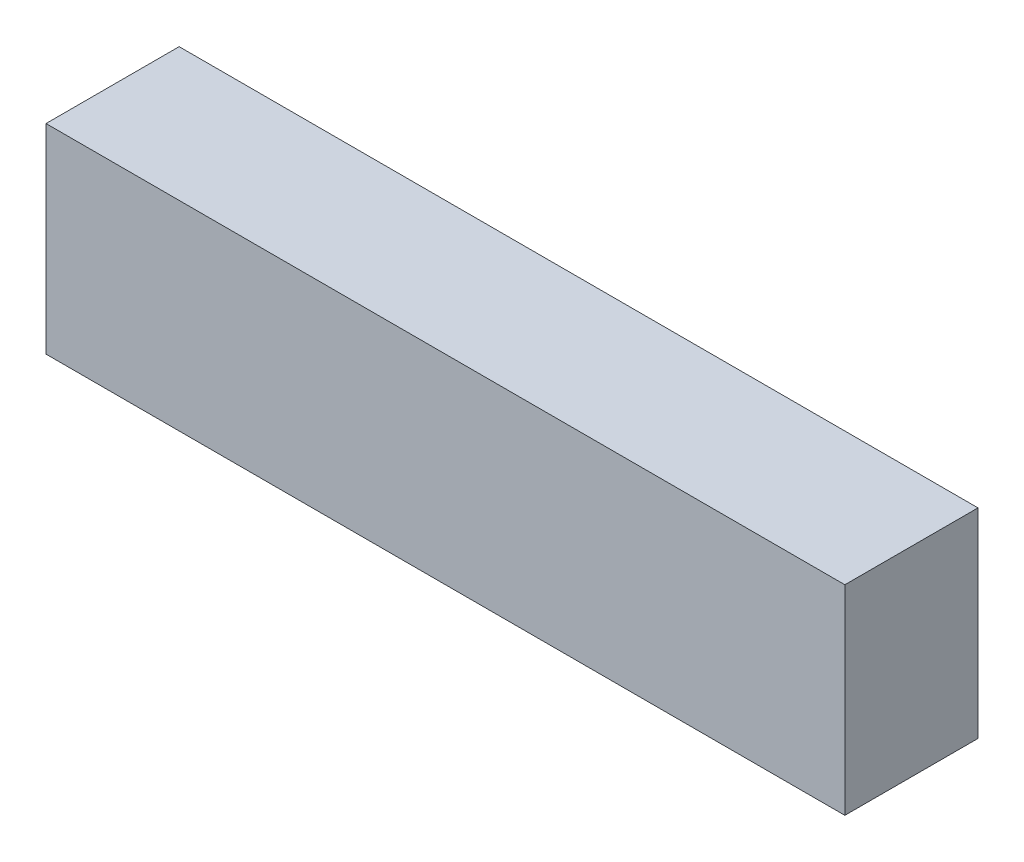
ISO-10303-21;
HEADER;
FILE_DESCRIPTION(('STEP AP214'),'2;1');
FILE_NAME('part.step','',(''),(''),'','','');
FILE_SCHEMA(('AUTOMOTIVE_DESIGN { 1 0 10303 214 1 1 1 1 }'));
ENDSEC;
DATA;
#1=APPLICATION_CONTEXT('core data for automotive mechanical design processes');
#2=APPLICATION_PROTOCOL_DEFINITION('international standard','automotive_design',2000,#1);
#3=PRODUCT_CONTEXT('',#1,'mechanical');
#4=PRODUCT('Part','Part','',(#3));
#5=PRODUCT_RELATED_PRODUCT_CATEGORY('part','',(#4));
#6=PRODUCT_DEFINITION_FORMATION('','',#4);
#7=PRODUCT_DEFINITION_CONTEXT('part definition',#1,'design');
#8=PRODUCT_DEFINITION('design','',#6,#7);
#9=PRODUCT_DEFINITION_SHAPE('','',#8);
#10=(LENGTH_UNIT() NAMED_UNIT(*) SI_UNIT(.MILLI.,.METRE.));
#11=(NAMED_UNIT(*) PLANE_ANGLE_UNIT() SI_UNIT($,.RADIAN.));
#12=(NAMED_UNIT(*) SI_UNIT($,.STERADIAN.) SOLID_ANGLE_UNIT());
#13=UNCERTAINTY_MEASURE_WITH_UNIT(LENGTH_MEASURE(1.E-05),#10,'distance_accuracy_value','');
#14=(GEOMETRIC_REPRESENTATION_CONTEXT(3) GLOBAL_UNCERTAINTY_ASSIGNED_CONTEXT((#13)) GLOBAL_UNIT_ASSIGNED_CONTEXT((#10,
#11,#12)) REPRESENTATION_CONTEXT('',''));
#15=CARTESIAN_POINT('',(0.,0.,0.));
#16=DIRECTION('',(0.,0.,1.));
#17=DIRECTION('',(1.,0.,0.));
#18=AXIS2_PLACEMENT_3D('',#15,#16,#17);
#19=CARTESIAN_POINT('',(-9.,-2.25,3.));
#20=DIRECTION('',(1.,0.,0.));
#21=DIRECTION('',(0.,0.,-1.));
#22=AXIS2_PLACEMENT_3D('',#19,#20,#21);
#23=PLANE('',#22);
#24=DIRECTION('',(0.,-1.,0.));
#25=VECTOR('',#24,1.);
#26=CARTESIAN_POINT('',(-9.,-2.25,0.));
#27=LINE('',#26,#25);
#28=CARTESIAN_POINT('',(-9.,2.25,0.));
#29=VERTEX_POINT('',#28);
#30=CARTESIAN_POINT('',(-9.,-2.25,0.));
#31=VERTEX_POINT('',#30);
#32=EDGE_CURVE('E99',#29,#31,#27,.T.);
#33=ORIENTED_EDGE('',*,*,#32,.T.);
#34=DIRECTION('',(0.,0.,-1.));
#35=VECTOR('',#34,1.);
#36=CARTESIAN_POINT('',(-9.,-2.25,3.));
#37=LINE('',#36,#35);
#38=CARTESIAN_POINT('',(-9.,-2.25,3.));
#39=VERTEX_POINT('',#38);
#40=EDGE_CURVE('E11',#39,#31,#37,.T.);
#41=ORIENTED_EDGE('',*,*,#40,.F.);
#42=DIRECTION('',(0.,-1.,0.));
#43=VECTOR('',#42,1.);
#44=CARTESIAN_POINT('',(-9.,-2.25,3.));
#45=LINE('',#44,#43);
#46=CARTESIAN_POINT('',(-9.,2.25,3.));
#47=VERTEX_POINT('',#46);
#48=EDGE_CURVE('E87',#47,#39,#45,.T.);
#49=ORIENTED_EDGE('',*,*,#48,.F.);
#50=DIRECTION('',(0.,0.,-1.));
#51=VECTOR('',#50,1.);
#52=CARTESIAN_POINT('',(-9.,2.25,3.));
#53=LINE('',#52,#51);
#54=EDGE_CURVE('E95',#47,#29,#53,.T.);
#55=ORIENTED_EDGE('',*,*,#54,.T.);
#56=EDGE_LOOP('',(#33,#41,#49,#55));
#57=FACE_BOUND('',#56,.T.);
#58=ADVANCED_FACE('F36',(#57),#23,.F.);
#59=CARTESIAN_POINT('',(9.,-2.25,3.));
#60=DIRECTION('',(0.,1.,0.));
#61=DIRECTION('',(-1.,0.,0.));
#62=AXIS2_PLACEMENT_3D('',#59,#60,#61);
#63=PLANE('',#62);
#64=DIRECTION('',(1.,0.,0.));
#65=VECTOR('',#64,1.);
#66=CARTESIAN_POINT('',(9.,-2.25,0.));
#67=LINE('',#66,#65);
#68=CARTESIAN_POINT('',(9.,-2.25,0.));
#69=VERTEX_POINT('',#68);
#70=EDGE_CURVE('E91',#31,#69,#67,.T.);
#71=ORIENTED_EDGE('',*,*,#70,.T.);
#72=DIRECTION('',(0.,0.,-1.));
#73=VECTOR('',#72,1.);
#74=CARTESIAN_POINT('',(9.,-2.25,3.));
#75=LINE('',#74,#73);
#76=CARTESIAN_POINT('',(9.,-2.25,3.));
#77=VERTEX_POINT('',#76);
#78=EDGE_CURVE('E44',#77,#69,#75,.T.);
#79=ORIENTED_EDGE('',*,*,#78,.F.);
#80=DIRECTION('',(1.,0.,0.));
#81=VECTOR('',#80,1.);
#82=CARTESIAN_POINT('',(9.,-2.25,3.));
#83=LINE('',#82,#81);
#84=EDGE_CURVE('E82',#39,#77,#83,.T.);
#85=ORIENTED_EDGE('',*,*,#84,.F.);
#86=ORIENTED_EDGE('',*,*,#40,.T.);
#87=EDGE_LOOP('',(#71,#79,#85,#86));
#88=FACE_BOUND('',#87,.T.);
#89=ADVANCED_FACE('F90',(#88),#63,.F.);
#90=CARTESIAN_POINT('',(9.,-2.25,3.));
#91=DIRECTION('',(-1.,0.,0.));
#92=DIRECTION('',(0.,0.,1.));
#93=AXIS2_PLACEMENT_3D('',#90,#91,#92);
#94=PLANE('',#93);
#95=DIRECTION('',(0.,1.,0.));
#96=VECTOR('',#95,1.);
#97=CARTESIAN_POINT('',(9.,-2.25,0.));
#98=LINE('',#97,#96);
#99=CARTESIAN_POINT('',(9.,2.25,0.));
#100=VERTEX_POINT('',#99);
#101=EDGE_CURVE('E69',#69,#100,#98,.T.);
#102=ORIENTED_EDGE('',*,*,#101,.T.);
#103=DIRECTION('',(0.,0.,-1.));
#104=VECTOR('',#103,1.);
#105=CARTESIAN_POINT('',(9.,2.25,3.));
#106=LINE('',#105,#104);
#107=CARTESIAN_POINT('',(9.,2.25,3.));
#108=VERTEX_POINT('',#107);
#109=EDGE_CURVE('E92',#108,#100,#106,.T.);
#110=ORIENTED_EDGE('',*,*,#109,.F.);
#111=DIRECTION('',(0.,1.,0.));
#112=VECTOR('',#111,1.);
#113=CARTESIAN_POINT('',(9.,-2.25,3.));
#114=LINE('',#113,#112);
#115=EDGE_CURVE('E85',#77,#108,#114,.T.);
#116=ORIENTED_EDGE('',*,*,#115,.F.);
#117=ORIENTED_EDGE('',*,*,#78,.T.);
#118=EDGE_LOOP('',(#102,#110,#116,#117));
#119=FACE_BOUND('',#118,.T.);
#120=ADVANCED_FACE('F93',(#119),#94,.F.);
#121=CARTESIAN_POINT('',(9.,2.25,3.));
#122=DIRECTION('',(0.,-1.,0.));
#123=DIRECTION('',(1.,0.,0.));
#124=AXIS2_PLACEMENT_3D('',#121,#122,#123);
#125=PLANE('',#124);
#126=DIRECTION('',(-1.,0.,0.));
#127=VECTOR('',#126,1.);
#128=CARTESIAN_POINT('',(9.,2.25,0.));
#129=LINE('',#128,#127);
#130=EDGE_CURVE('E75',#100,#29,#129,.T.);
#131=ORIENTED_EDGE('',*,*,#130,.T.);
#132=ORIENTED_EDGE('',*,*,#54,.F.);
#133=DIRECTION('',(-1.,0.,0.));
#134=VECTOR('',#133,1.);
#135=CARTESIAN_POINT('',(9.,2.25,3.));
#136=LINE('',#135,#134);
#137=EDGE_CURVE('E52',#108,#47,#136,.T.);
#138=ORIENTED_EDGE('',*,*,#137,.F.);
#139=ORIENTED_EDGE('',*,*,#109,.T.);
#140=EDGE_LOOP('',(#131,#132,#138,#139));
#141=FACE_BOUND('',#140,.T.);
#142=ADVANCED_FACE('F106',(#141),#125,.F.);
#143=CARTESIAN_POINT('',(0.,0.,3.));
#144=DIRECTION('',(0.,0.,1.));
#145=DIRECTION('',(1.,0.,0.));
#146=AXIS2_PLACEMENT_3D('',#143,#144,#145);
#147=PLANE('',#146);
#148=ORIENTED_EDGE('',*,*,#48,.T.);
#149=ORIENTED_EDGE('',*,*,#84,.T.);
#150=ORIENTED_EDGE('',*,*,#115,.T.);
#151=ORIENTED_EDGE('',*,*,#137,.T.);
#152=EDGE_LOOP('',(#148,#149,#150,#151));
#153=FACE_BOUND('',#152,.T.);
#154=ADVANCED_FACE('F83',(#153),#147,.T.);
#155=CARTESIAN_POINT('',(0.,0.,0.));
#156=DIRECTION('',(0.,0.,1.));
#157=DIRECTION('',(1.,0.,0.));
#158=AXIS2_PLACEMENT_3D('',#155,#156,#157);
#159=PLANE('',#158);
#160=ORIENTED_EDGE('',*,*,#32,.F.);
#161=ORIENTED_EDGE('',*,*,#130,.F.);
#162=ORIENTED_EDGE('',*,*,#101,.F.);
#163=ORIENTED_EDGE('',*,*,#70,.F.);
#164=EDGE_LOOP('',(#160,#161,#162,#163));
#165=FACE_BOUND('',#164,.T.);
#166=ADVANCED_FACE('F109',(#165),#159,.F.);
#167=CLOSED_SHELL('',(#58,#89,#120,#142,#154,#166));
#168=MANIFOLD_SOLID_BREP('B2',#167);
#169=ADVANCED_BREP_SHAPE_REPRESENTATION('',(#18,#168),#14);
#170=SHAPE_DEFINITION_REPRESENTATION(#9,#169);
ENDSEC;
END-ISO-10303-21;
